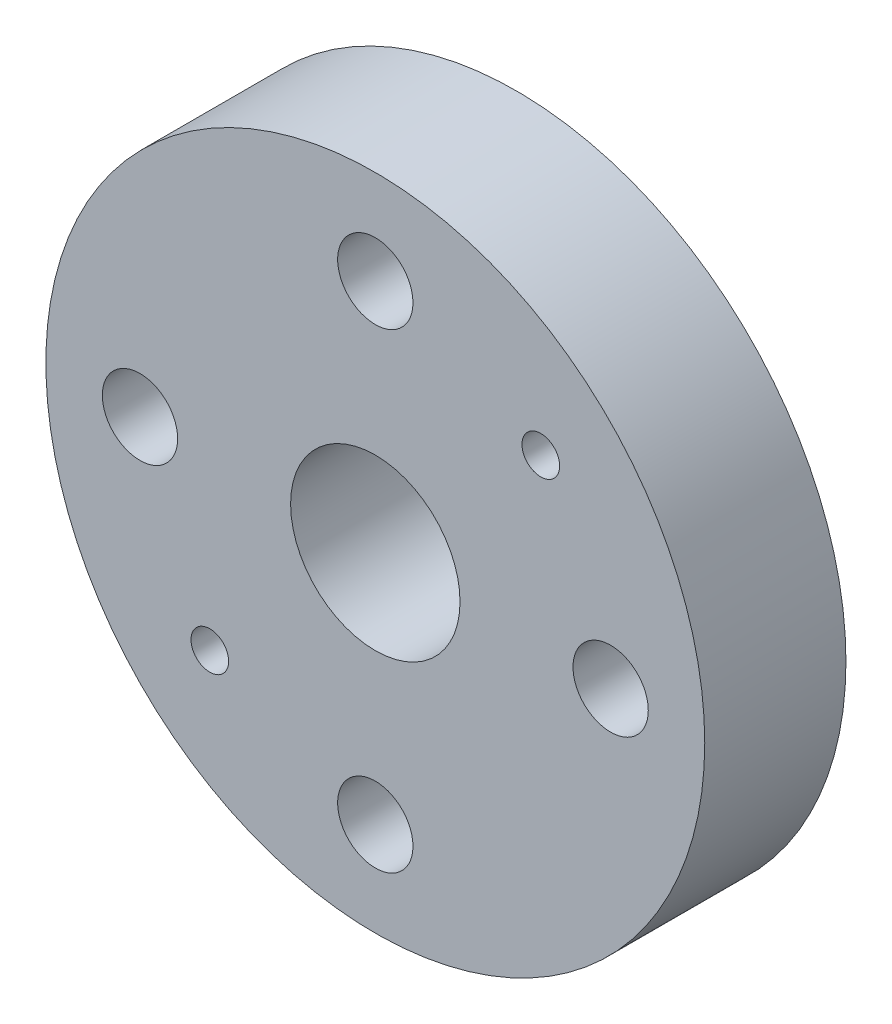
ISO-10303-21;
HEADER;
FILE_DESCRIPTION(('STEP AP214'),'2;1');
FILE_NAME('part.step','',(''),(''),'','','');
FILE_SCHEMA(('AUTOMOTIVE_DESIGN { 1 0 10303 214 1 1 1 1 }'));
ENDSEC;
DATA;
#1=APPLICATION_CONTEXT('core data for automotive mechanical design processes');
#2=APPLICATION_PROTOCOL_DEFINITION('international standard','automotive_design',2000,#1);
#3=PRODUCT_CONTEXT('',#1,'mechanical');
#4=PRODUCT('Part','Part','',(#3));
#5=PRODUCT_RELATED_PRODUCT_CATEGORY('part','',(#4));
#6=PRODUCT_DEFINITION_FORMATION('','',#4);
#7=PRODUCT_DEFINITION_CONTEXT('part definition',#1,'design');
#8=PRODUCT_DEFINITION('design','',#6,#7);
#9=PRODUCT_DEFINITION_SHAPE('','',#8);
#10=(LENGTH_UNIT() NAMED_UNIT(*) SI_UNIT(.MILLI.,.METRE.));
#11=(NAMED_UNIT(*) PLANE_ANGLE_UNIT() SI_UNIT($,.RADIAN.));
#12=(NAMED_UNIT(*) SI_UNIT($,.STERADIAN.) SOLID_ANGLE_UNIT());
#13=UNCERTAINTY_MEASURE_WITH_UNIT(LENGTH_MEASURE(1.E-05),#10,'distance_accuracy_value','');
#14=(GEOMETRIC_REPRESENTATION_CONTEXT(3) GLOBAL_UNCERTAINTY_ASSIGNED_CONTEXT((#13)) GLOBAL_UNIT_ASSIGNED_CONTEXT((#10,
#11,#12)) REPRESENTATION_CONTEXT('',''));
#15=CARTESIAN_POINT('',(0.,0.,0.));
#16=DIRECTION('',(0.,0.,1.));
#17=DIRECTION('',(1.,0.,0.));
#18=AXIS2_PLACEMENT_3D('',#15,#16,#17);
#19=CARTESIAN_POINT('',(-17.5810723961301,-17.773741682663,121.));
#20=DIRECTION('',(0.,0.,1.));
#21=DIRECTION('',(1.,0.,0.));
#22=AXIS2_PLACEMENT_3D('',#19,#20,#21);
#23=CYLINDRICAL_SURFACE('',#22,3.);
#24=CARTESIAN_POINT('',(-17.5810723961301,-17.773741682663,121.));
#25=DIRECTION('',(0.,0.,1.));
#26=DIRECTION('',(1.,0.,0.));
#27=AXIS2_PLACEMENT_3D('',#24,#25,#26);
#28=CIRCLE('',#27,3.);
#29=CARTESIAN_POINT('',(-14.5810723961301,-17.773741682663,121.));
#30=VERTEX_POINT('',#29);
#31=EDGE_CURVE('E83',#30,#30,#28,.T.);
#32=ORIENTED_EDGE('',*,*,#31,.F.);
#33=EDGE_LOOP('',(#32));
#34=FACE_BOUND('',#33,.T.);
#35=CARTESIAN_POINT('',(-17.5810723961301,-17.773741682663,129.5));
#36=DIRECTION('',(0.,0.,1.));
#37=DIRECTION('',(1.,0.,0.));
#38=AXIS2_PLACEMENT_3D('',#35,#36,#37);
#39=CIRCLE('',#38,3.);
#40=CARTESIAN_POINT('',(-14.5810723961301,-17.773741682663,129.5));
#41=VERTEX_POINT('',#40);
#42=EDGE_CURVE('E10',#41,#41,#39,.F.);
#43=ORIENTED_EDGE('',*,*,#42,.F.);
#44=EDGE_LOOP('',(#43));
#45=FACE_BOUND('',#44,.T.);
#46=ADVANCED_FACE('F45',(#34,#45),#23,.F.);
#47=CARTESIAN_POINT('',(17.5810723961301,17.773741682663,121.));
#48=DIRECTION('',(0.,0.,1.));
#49=DIRECTION('',(1.,0.,0.));
#50=AXIS2_PLACEMENT_3D('',#47,#48,#49);
#51=CYLINDRICAL_SURFACE('',#50,3.);
#52=CARTESIAN_POINT('',(17.5810723961301,17.773741682663,121.));
#53=DIRECTION('',(0.,0.,1.));
#54=DIRECTION('',(1.,0.,0.));
#55=AXIS2_PLACEMENT_3D('',#52,#53,#54);
#56=CIRCLE('',#55,3.);
#57=CARTESIAN_POINT('',(20.5810723961301,17.773741682663,121.));
#58=VERTEX_POINT('',#57);
#59=EDGE_CURVE('E110',#58,#58,#56,.T.);
#60=ORIENTED_EDGE('',*,*,#59,.F.);
#61=EDGE_LOOP('',(#60));
#62=FACE_BOUND('',#61,.T.);
#63=CARTESIAN_POINT('',(17.5810723961301,17.773741682663,129.5));
#64=DIRECTION('',(0.,0.,1.));
#65=DIRECTION('',(1.,0.,0.));
#66=AXIS2_PLACEMENT_3D('',#63,#64,#65);
#67=CIRCLE('',#66,3.);
#68=CARTESIAN_POINT('',(20.5810723961301,17.773741682663,129.5));
#69=VERTEX_POINT('',#68);
#70=EDGE_CURVE('E53',#69,#69,#67,.F.);
#71=ORIENTED_EDGE('',*,*,#70,.F.);
#72=EDGE_LOOP('',(#71));
#73=FACE_BOUND('',#72,.T.);
#74=ADVANCED_FACE('F147',(#62,#73),#51,.F.);
#75=CARTESIAN_POINT('',(0.,0.,136.));
#76=DIRECTION('',(0.,0.,-1.));
#77=DIRECTION('',(-1.,0.,0.));
#78=AXIS2_PLACEMENT_3D('',#75,#76,#77);
#79=CYLINDRICAL_SURFACE('',#78,35.);
#80=CARTESIAN_POINT('',(0.,0.,136.));
#81=DIRECTION('',(0.,0.,1.));
#82=DIRECTION('',(1.,0.,0.));
#83=AXIS2_PLACEMENT_3D('',#80,#81,#82);
#84=CIRCLE('',#83,35.);
#85=CARTESIAN_POINT('',(35.,0.,136.));
#86=VERTEX_POINT('',#85);
#87=EDGE_CURVE('E58',#86,#86,#84,.T.);
#88=ORIENTED_EDGE('',*,*,#87,.F.);
#89=EDGE_LOOP('',(#88));
#90=FACE_BOUND('',#89,.T.);
#91=CARTESIAN_POINT('',(0.,0.,121.));
#92=DIRECTION('',(0.,0.,1.));
#93=DIRECTION('',(1.,0.,0.));
#94=AXIS2_PLACEMENT_3D('',#91,#92,#93);
#95=CIRCLE('',#94,35.);
#96=CARTESIAN_POINT('',(35.,0.,121.));
#97=VERTEX_POINT('',#96);
#98=EDGE_CURVE('E63',#97,#97,#95,.T.);
#99=ORIENTED_EDGE('',*,*,#98,.T.);
#100=EDGE_LOOP('',(#99));
#101=FACE_BOUND('',#100,.T.);
#102=ADVANCED_FACE('F47',(#90,#101),#79,.T.);
#103=CARTESIAN_POINT('',(0.,0.,136.));
#104=DIRECTION('',(0.,0.,1.));
#105=DIRECTION('',(1.,0.,0.));
#106=AXIS2_PLACEMENT_3D('',#103,#104,#105);
#107=PLANE('',#106);
#108=CARTESIAN_POINT('',(-25.,0.,136.));
#109=DIRECTION('',(0.,0.,1.));
#110=DIRECTION('',(1.,0.,0.));
#111=AXIS2_PLACEMENT_3D('',#108,#109,#110);
#112=CIRCLE('',#111,4.);
#113=CARTESIAN_POINT('',(-21.,0.,136.));
#114=VERTEX_POINT('',#113);
#115=EDGE_CURVE('E103',#114,#114,#112,.T.);
#116=ORIENTED_EDGE('',*,*,#115,.F.);
#117=EDGE_LOOP('',(#116));
#118=FACE_BOUND('',#117,.T.);
#119=CARTESIAN_POINT('',(0.,25.,136.));
#120=DIRECTION('',(0.,0.,1.));
#121=DIRECTION('',(1.,0.,0.));
#122=AXIS2_PLACEMENT_3D('',#119,#120,#121);
#123=CIRCLE('',#122,4.);
#124=CARTESIAN_POINT('',(4.,25.,136.));
#125=VERTEX_POINT('',#124);
#126=EDGE_CURVE('E99',#125,#125,#123,.T.);
#127=ORIENTED_EDGE('',*,*,#126,.F.);
#128=EDGE_LOOP('',(#127));
#129=FACE_BOUND('',#128,.T.);
#130=CARTESIAN_POINT('',(25.,0.,136.));
#131=DIRECTION('',(0.,0.,1.));
#132=DIRECTION('',(1.,0.,0.));
#133=AXIS2_PLACEMENT_3D('',#130,#131,#132);
#134=CIRCLE('',#133,4.);
#135=CARTESIAN_POINT('',(29.,0.,136.));
#136=VERTEX_POINT('',#135);
#137=EDGE_CURVE('E91',#136,#136,#134,.T.);
#138=ORIENTED_EDGE('',*,*,#137,.F.);
#139=EDGE_LOOP('',(#138));
#140=FACE_BOUND('',#139,.T.);
#141=CARTESIAN_POINT('',(0.,-25.,136.));
#142=DIRECTION('',(0.,0.,1.));
#143=DIRECTION('',(1.,0.,0.));
#144=AXIS2_PLACEMENT_3D('',#141,#142,#143);
#145=CIRCLE('',#144,4.);
#146=CARTESIAN_POINT('',(4.,-25.,136.));
#147=VERTEX_POINT('',#146);
#148=EDGE_CURVE('E82',#147,#147,#145,.T.);
#149=ORIENTED_EDGE('',*,*,#148,.F.);
#150=EDGE_LOOP('',(#149));
#151=FACE_BOUND('',#150,.T.);
#152=CARTESIAN_POINT('',(0.,0.,136.));
#153=DIRECTION('',(0.,0.,1.));
#154=DIRECTION('',(1.,0.,0.));
#155=AXIS2_PLACEMENT_3D('',#152,#153,#154);
#156=CIRCLE('',#155,9.);
#157=CARTESIAN_POINT('',(9.,0.,136.));
#158=VERTEX_POINT('',#157);
#159=EDGE_CURVE('E68',#158,#158,#156,.T.);
#160=ORIENTED_EDGE('',*,*,#159,.F.);
#161=EDGE_LOOP('',(#160));
#162=FACE_BOUND('',#161,.T.);
#163=ORIENTED_EDGE('',*,*,#87,.T.);
#164=EDGE_LOOP('',(#163));
#165=FACE_BOUND('',#164,.T.);
#166=CARTESIAN_POINT('',(17.5810723961301,17.773741682663,136.));
#167=DIRECTION('',(0.,0.,1.));
#168=DIRECTION('',(1.,0.,0.));
#169=AXIS2_PLACEMENT_3D('',#166,#167,#168);
#170=CIRCLE('',#169,2.);
#171=CARTESIAN_POINT('',(19.5810723961301,17.773741682663,136.));
#172=VERTEX_POINT('',#171);
#173=EDGE_CURVE('E118',#172,#172,#170,.T.);
#174=ORIENTED_EDGE('',*,*,#173,.F.);
#175=EDGE_LOOP('',(#174));
#176=FACE_BOUND('',#175,.T.);
#177=CARTESIAN_POINT('',(-17.5810723961301,-17.773741682663,136.));
#178=DIRECTION('',(0.,0.,1.));
#179=DIRECTION('',(1.,0.,0.));
#180=AXIS2_PLACEMENT_3D('',#177,#178,#179);
#181=CIRCLE('',#180,2.);
#182=CARTESIAN_POINT('',(-15.5810723961301,-17.773741682663,136.));
#183=VERTEX_POINT('',#182);
#184=EDGE_CURVE('E122',#183,#183,#181,.T.);
#185=ORIENTED_EDGE('',*,*,#184,.F.);
#186=EDGE_LOOP('',(#185));
#187=FACE_BOUND('',#186,.T.);
#188=ADVANCED_FACE('F136',(#118,#129,#140,#151,#162,#165,#176,#187),#107,.T.);
#189=CARTESIAN_POINT('',(0.,0.,121.));
#190=DIRECTION('',(0.,0.,1.));
#191=DIRECTION('',(1.,0.,0.));
#192=AXIS2_PLACEMENT_3D('',#189,#190,#191);
#193=PLANE('',#192);
#194=ORIENTED_EDGE('',*,*,#31,.T.);
#195=EDGE_LOOP('',(#194));
#196=FACE_BOUND('',#195,.T.);
#197=ORIENTED_EDGE('',*,*,#59,.T.);
#198=EDGE_LOOP('',(#197));
#199=FACE_BOUND('',#198,.T.);
#200=CARTESIAN_POINT('',(0.,0.,121.));
#201=DIRECTION('',(0.,0.,-1.));
#202=DIRECTION('',(-1.,0.,0.));
#203=AXIS2_PLACEMENT_3D('',#200,#201,#202);
#204=CIRCLE('',#203,9.);
#205=CARTESIAN_POINT('',(-9.,0.,121.));
#206=VERTEX_POINT('',#205);
#207=EDGE_CURVE('E73',#206,#206,#204,.T.);
#208=ORIENTED_EDGE('',*,*,#207,.F.);
#209=EDGE_LOOP('',(#208));
#210=FACE_BOUND('',#209,.T.);
#211=ORIENTED_EDGE('',*,*,#98,.F.);
#212=EDGE_LOOP('',(#211));
#213=FACE_BOUND('',#212,.T.);
#214=ADVANCED_FACE('F138',(#196,#199,#210,#213),#193,.F.);
#215=CARTESIAN_POINT('',(0.,0.,167.));
#216=DIRECTION('',(0.,0.,-1.));
#217=DIRECTION('',(-1.,0.,0.));
#218=AXIS2_PLACEMENT_3D('',#215,#216,#217);
#219=CYLINDRICAL_SURFACE('',#218,9.);
#220=ORIENTED_EDGE('',*,*,#159,.T.);
#221=EDGE_LOOP('',(#220));
#222=FACE_BOUND('',#221,.T.);
#223=ORIENTED_EDGE('',*,*,#207,.T.);
#224=EDGE_LOOP('',(#223));
#225=FACE_BOUND('',#224,.T.);
#226=ADVANCED_FACE('F145',(#222,#225),#219,.F.);
#227=CARTESIAN_POINT('',(0.,-25.,129.5));
#228=DIRECTION('',(0.,0.,1.));
#229=DIRECTION('',(1.,0.,0.));
#230=AXIS2_PLACEMENT_3D('',#227,#228,#229);
#231=CYLINDRICAL_SURFACE('',#230,4.);
#232=CARTESIAN_POINT('',(0.,-25.,129.5));
#233=DIRECTION('',(0.,0.,1.));
#234=DIRECTION('',(1.,0.,0.));
#235=AXIS2_PLACEMENT_3D('',#232,#233,#234);
#236=CIRCLE('',#235,4.);
#237=CARTESIAN_POINT('',(4.,-25.,129.5));
#238=VERTEX_POINT('',#237);
#239=EDGE_CURVE('E78',#238,#238,#236,.T.);
#240=CARTESIAN_POINT('',(4.,-25.,129.5));
#241=CARTESIAN_POINT('',(4.,-25.,129.567708333333));
#242=CARTESIAN_POINT('',(4.,-25.,129.635416666667));
#243=CARTESIAN_POINT('',(4.,-25.,129.770833333333));
#244=CARTESIAN_POINT('',(4.,-25.,129.838541666667));
#245=CARTESIAN_POINT('',(4.,-25.,129.973958333333));
#246=CARTESIAN_POINT('',(4.,-25.,130.041666666667));
#247=CARTESIAN_POINT('',(4.,-25.,130.177083333333));
#248=CARTESIAN_POINT('',(4.,-25.,130.244791666667));
#249=CARTESIAN_POINT('',(4.,-25.,130.380208333333));
#250=CARTESIAN_POINT('',(4.,-25.,130.447916666667));
#251=CARTESIAN_POINT('',(4.,-25.,130.583333333333));
#252=CARTESIAN_POINT('',(4.,-25.,130.651041666667));
#253=CARTESIAN_POINT('',(4.,-25.,130.786458333333));
#254=CARTESIAN_POINT('',(4.,-25.,130.854166666667));
#255=CARTESIAN_POINT('',(4.,-25.,130.989583333333));
#256=CARTESIAN_POINT('',(4.,-25.,131.057291666667));
#257=CARTESIAN_POINT('',(4.,-25.,131.192708333333));
#258=CARTESIAN_POINT('',(4.,-25.,131.260416666667));
#259=CARTESIAN_POINT('',(4.,-25.,131.395833333333));
#260=CARTESIAN_POINT('',(4.,-25.,131.463541666667));
#261=CARTESIAN_POINT('',(4.,-25.,131.598958333333));
#262=CARTESIAN_POINT('',(4.,-25.,131.666666666667));
#263=CARTESIAN_POINT('',(4.,-25.,131.802083333333));
#264=CARTESIAN_POINT('',(4.,-25.,131.869791666667));
#265=CARTESIAN_POINT('',(4.,-25.,132.005208333333));
#266=CARTESIAN_POINT('',(4.,-25.,132.072916666667));
#267=CARTESIAN_POINT('',(4.,-25.,132.208333333333));
#268=CARTESIAN_POINT('',(4.,-25.,132.276041666667));
#269=CARTESIAN_POINT('',(4.,-25.,132.411458333333));
#270=CARTESIAN_POINT('',(4.,-25.,132.479166666667));
#271=CARTESIAN_POINT('',(4.,-25.,132.614583333333));
#272=CARTESIAN_POINT('',(4.,-25.,132.682291666667));
#273=CARTESIAN_POINT('',(4.,-25.,132.817708333333));
#274=CARTESIAN_POINT('',(4.,-25.,132.885416666667));
#275=CARTESIAN_POINT('',(4.,-25.,133.020833333333));
#276=CARTESIAN_POINT('',(4.,-25.,133.088541666667));
#277=CARTESIAN_POINT('',(4.,-25.,133.223958333333));
#278=CARTESIAN_POINT('',(4.,-25.,133.291666666667));
#279=CARTESIAN_POINT('',(4.,-25.,133.427083333333));
#280=CARTESIAN_POINT('',(4.,-25.,133.494791666667));
#281=CARTESIAN_POINT('',(4.,-25.,133.630208333333));
#282=CARTESIAN_POINT('',(4.,-25.,133.697916666667));
#283=CARTESIAN_POINT('',(4.,-25.,133.833333333333));
#284=CARTESIAN_POINT('',(4.,-25.,133.901041666667));
#285=CARTESIAN_POINT('',(4.,-25.,134.036458333333));
#286=CARTESIAN_POINT('',(4.,-25.,134.104166666667));
#287=CARTESIAN_POINT('',(4.,-25.,134.239583333333));
#288=CARTESIAN_POINT('',(4.,-25.,134.307291666667));
#289=CARTESIAN_POINT('',(4.,-25.,134.442708333333));
#290=CARTESIAN_POINT('',(4.,-25.,134.510416666667));
#291=CARTESIAN_POINT('',(4.,-25.,134.645833333333));
#292=CARTESIAN_POINT('',(4.,-25.,134.713541666667));
#293=CARTESIAN_POINT('',(4.,-25.,134.848958333333));
#294=CARTESIAN_POINT('',(4.,-25.,134.916666666667));
#295=CARTESIAN_POINT('',(4.,-25.,135.052083333333));
#296=CARTESIAN_POINT('',(4.,-25.,135.119791666667));
#297=CARTESIAN_POINT('',(4.,-25.,135.255208333333));
#298=CARTESIAN_POINT('',(4.,-25.,135.322916666667));
#299=CARTESIAN_POINT('',(4.,-25.,135.458333333333));
#300=CARTESIAN_POINT('',(4.,-25.,135.526041666667));
#301=CARTESIAN_POINT('',(4.,-25.,135.661458333333));
#302=CARTESIAN_POINT('',(4.,-25.,135.729166666667));
#303=CARTESIAN_POINT('',(4.,-25.,135.864583333333));
#304=CARTESIAN_POINT('',(4.,-25.,135.932291666667));
#305=CARTESIAN_POINT('',(4.,-25.,136.));
#306=B_SPLINE_CURVE_WITH_KNOTS('',3,(#240,#241,#242,#243,#244,#245,#246,#247,#248,#249,#250,
#251,#252,#253,#254,#255,#256,#257,#258,#259,#260,#261,#262,#263,#264,#265,#266,#267,#268,#269,
#270,#271,#272,#273,#274,#275,#276,#277,#278,#279,#280,#281,#282,#283,#284,#285,#286,#287,#288,
#289,#290,#291,#292,#293,#294,#295,#296,#297,#298,#299,#300,#301,#302,#303,#304,#305),
.UNSPECIFIED.,.F.,.F.,(4,2,2,2,2,2,2,2,2,2,2,2,2,2,2,2,2,2,2,2,2,2,2,2,2,2,2,2,2,2,2,2,4),(0.,
0.203125000000026,0.406250000000025,0.609375000000023,0.812500000000022,1.01562500000002,
1.21875000000002,1.42187500000002,1.62500000000002,1.82812500000001,2.03125000000001,
2.23437500000001,2.43750000000001,2.64062500000001,2.84375000000001,3.046875,3.25000000000003,
3.45312500000003,3.65625000000003,3.85937500000003,4.06250000000002,4.26562500000002,
4.46875000000002,4.67187500000002,4.87500000000002,5.07812500000002,5.28125000000002,
5.48437500000001,5.68750000000001,5.89062500000001,6.09375000000001,6.29687500000001,
6.50000000000003),.UNSPECIFIED.);
#307=EDGE_CURVE('BSEAM191',#238,#147,#306,.T.);
#308=ORIENTED_EDGE('',*,*,#239,.F.);
#309=ORIENTED_EDGE('',*,*,#148,.T.);
#310=ORIENTED_EDGE('',*,*,#307,.T.);
#311=ORIENTED_EDGE('',*,*,#307,.F.);
#312=EDGE_LOOP('',(#308,#310,#309,#311));
#313=FACE_BOUND('',#312,.T.);
#314=ADVANCED_FACE('F191',(#313),#231,.F.);
#315=CARTESIAN_POINT('',(0.,-25.,129.5));
#316=DIRECTION('',(0.,0.,1.));
#317=DIRECTION('',(1.,0.,0.));
#318=AXIS2_PLACEMENT_3D('',#315,#316,#317);
#319=PLANE('',#318);
#320=ORIENTED_EDGE('',*,*,#239,.T.);
#321=EDGE_LOOP('',(#320));
#322=FACE_BOUND('',#321,.T.);
#323=ADVANCED_FACE('F186',(#322),#319,.T.);
#324=CARTESIAN_POINT('',(25.,0.,129.5));
#325=DIRECTION('',(0.,0.,1.));
#326=DIRECTION('',(1.,0.,0.));
#327=AXIS2_PLACEMENT_3D('',#324,#325,#326);
#328=CYLINDRICAL_SURFACE('',#327,4.);
#329=CARTESIAN_POINT('',(25.,0.,129.5));
#330=DIRECTION('',(0.,0.,1.));
#331=DIRECTION('',(1.,0.,0.));
#332=AXIS2_PLACEMENT_3D('',#329,#330,#331);
#333=CIRCLE('',#332,4.);
#334=CARTESIAN_POINT('',(29.,0.,129.5));
#335=VERTEX_POINT('',#334);
#336=EDGE_CURVE('E87',#335,#335,#333,.T.);
#337=CARTESIAN_POINT('',(29.,0.,129.5));
#338=CARTESIAN_POINT('',(29.,0.,129.567708333333));
#339=CARTESIAN_POINT('',(29.,0.,129.635416666667));
#340=CARTESIAN_POINT('',(29.,0.,129.770833333333));
#341=CARTESIAN_POINT('',(29.,0.,129.838541666667));
#342=CARTESIAN_POINT('',(29.,0.,129.973958333333));
#343=CARTESIAN_POINT('',(29.,0.,130.041666666667));
#344=CARTESIAN_POINT('',(29.,0.,130.177083333333));
#345=CARTESIAN_POINT('',(29.,0.,130.244791666667));
#346=CARTESIAN_POINT('',(29.,0.,130.380208333333));
#347=CARTESIAN_POINT('',(29.,0.,130.447916666667));
#348=CARTESIAN_POINT('',(29.,0.,130.583333333333));
#349=CARTESIAN_POINT('',(29.,0.,130.651041666667));
#350=CARTESIAN_POINT('',(29.,0.,130.786458333333));
#351=CARTESIAN_POINT('',(29.,0.,130.854166666667));
#352=CARTESIAN_POINT('',(29.,0.,130.989583333333));
#353=CARTESIAN_POINT('',(29.,0.,131.057291666667));
#354=CARTESIAN_POINT('',(29.,0.,131.192708333333));
#355=CARTESIAN_POINT('',(29.,0.,131.260416666667));
#356=CARTESIAN_POINT('',(29.,0.,131.395833333333));
#357=CARTESIAN_POINT('',(29.,0.,131.463541666667));
#358=CARTESIAN_POINT('',(29.,0.,131.598958333333));
#359=CARTESIAN_POINT('',(29.,0.,131.666666666667));
#360=CARTESIAN_POINT('',(29.,0.,131.802083333333));
#361=CARTESIAN_POINT('',(29.,0.,131.869791666667));
#362=CARTESIAN_POINT('',(29.,0.,132.005208333333));
#363=CARTESIAN_POINT('',(29.,0.,132.072916666667));
#364=CARTESIAN_POINT('',(29.,0.,132.208333333333));
#365=CARTESIAN_POINT('',(29.,0.,132.276041666667));
#366=CARTESIAN_POINT('',(29.,0.,132.411458333333));
#367=CARTESIAN_POINT('',(29.,0.,132.479166666667));
#368=CARTESIAN_POINT('',(29.,0.,132.614583333333));
#369=CARTESIAN_POINT('',(29.,0.,132.682291666667));
#370=CARTESIAN_POINT('',(29.,0.,132.817708333333));
#371=CARTESIAN_POINT('',(29.,0.,132.885416666667));
#372=CARTESIAN_POINT('',(29.,0.,133.020833333333));
#373=CARTESIAN_POINT('',(29.,0.,133.088541666667));
#374=CARTESIAN_POINT('',(29.,0.,133.223958333333));
#375=CARTESIAN_POINT('',(29.,0.,133.291666666667));
#376=CARTESIAN_POINT('',(29.,0.,133.427083333333));
#377=CARTESIAN_POINT('',(29.,0.,133.494791666667));
#378=CARTESIAN_POINT('',(29.,0.,133.630208333333));
#379=CARTESIAN_POINT('',(29.,0.,133.697916666667));
#380=CARTESIAN_POINT('',(29.,0.,133.833333333333));
#381=CARTESIAN_POINT('',(29.,0.,133.901041666667));
#382=CARTESIAN_POINT('',(29.,0.,134.036458333333));
#383=CARTESIAN_POINT('',(29.,0.,134.104166666667));
#384=CARTESIAN_POINT('',(29.,0.,134.239583333333));
#385=CARTESIAN_POINT('',(29.,0.,134.307291666667));
#386=CARTESIAN_POINT('',(29.,0.,134.442708333333));
#387=CARTESIAN_POINT('',(29.,0.,134.510416666667));
#388=CARTESIAN_POINT('',(29.,0.,134.645833333333));
#389=CARTESIAN_POINT('',(29.,0.,134.713541666667));
#390=CARTESIAN_POINT('',(29.,0.,134.848958333333));
#391=CARTESIAN_POINT('',(29.,0.,134.916666666667));
#392=CARTESIAN_POINT('',(29.,0.,135.052083333333));
#393=CARTESIAN_POINT('',(29.,0.,135.119791666667));
#394=CARTESIAN_POINT('',(29.,0.,135.255208333333));
#395=CARTESIAN_POINT('',(29.,0.,135.322916666667));
#396=CARTESIAN_POINT('',(29.,0.,135.458333333333));
#397=CARTESIAN_POINT('',(29.,0.,135.526041666667));
#398=CARTESIAN_POINT('',(29.,0.,135.661458333333));
#399=CARTESIAN_POINT('',(29.,0.,135.729166666667));
#400=CARTESIAN_POINT('',(29.,0.,135.864583333333));
#401=CARTESIAN_POINT('',(29.,0.,135.932291666667));
#402=CARTESIAN_POINT('',(29.,0.,136.));
#403=B_SPLINE_CURVE_WITH_KNOTS('',3,(#337,#338,#339,#340,#341,#342,#343,#344,#345,#346,#347,
#348,#349,#350,#351,#352,#353,#354,#355,#356,#357,#358,#359,#360,#361,#362,#363,#364,#365,#366,
#367,#368,#369,#370,#371,#372,#373,#374,#375,#376,#377,#378,#379,#380,#381,#382,#383,#384,#385,
#386,#387,#388,#389,#390,#391,#392,#393,#394,#395,#396,#397,#398,#399,#400,#401,#402),
.UNSPECIFIED.,.F.,.F.,(4,2,2,2,2,2,2,2,2,2,2,2,2,2,2,2,2,2,2,2,2,2,2,2,2,2,2,2,2,2,2,2,4),(0.,
0.203125000000026,0.406250000000025,0.609375000000023,0.812500000000022,1.01562500000002,
1.21875000000002,1.42187500000002,1.62500000000002,1.82812500000001,2.03125000000001,
2.23437500000001,2.43750000000001,2.64062500000001,2.84375000000001,3.046875,3.25000000000003,
3.45312500000003,3.65625000000003,3.85937500000003,4.06250000000002,4.26562500000002,
4.46875000000002,4.67187500000002,4.87500000000002,5.07812500000002,5.28125000000002,
5.48437500000001,5.68750000000001,5.89062500000001,6.09375000000001,6.29687500000001,
6.50000000000003),.UNSPECIFIED.);
#404=EDGE_CURVE('BSEAM183',#335,#136,#403,.T.);
#405=ORIENTED_EDGE('',*,*,#336,.F.);
#406=ORIENTED_EDGE('',*,*,#137,.T.);
#407=ORIENTED_EDGE('',*,*,#404,.T.);
#408=ORIENTED_EDGE('',*,*,#404,.F.);
#409=EDGE_LOOP('',(#405,#407,#406,#408));
#410=FACE_BOUND('',#409,.T.);
#411=ADVANCED_FACE('F183',(#410),#328,.F.);
#412=CARTESIAN_POINT('',(25.,0.,129.5));
#413=DIRECTION('',(0.,0.,1.));
#414=DIRECTION('',(1.,0.,0.));
#415=AXIS2_PLACEMENT_3D('',#412,#413,#414);
#416=PLANE('',#415);
#417=ORIENTED_EDGE('',*,*,#336,.T.);
#418=EDGE_LOOP('',(#417));
#419=FACE_BOUND('',#418,.T.);
#420=ADVANCED_FACE('F178',(#419),#416,.T.);
#421=CARTESIAN_POINT('',(0.,25.,129.5));
#422=DIRECTION('',(0.,0.,1.));
#423=DIRECTION('',(1.,0.,0.));
#424=AXIS2_PLACEMENT_3D('',#421,#422,#423);
#425=CYLINDRICAL_SURFACE('',#424,4.);
#426=CARTESIAN_POINT('',(0.,25.,129.5));
#427=DIRECTION('',(0.,0.,1.));
#428=DIRECTION('',(1.,0.,0.));
#429=AXIS2_PLACEMENT_3D('',#426,#427,#428);
#430=CIRCLE('',#429,4.);
#431=CARTESIAN_POINT('',(4.,25.,129.5));
#432=VERTEX_POINT('',#431);
#433=EDGE_CURVE('E95',#432,#432,#430,.T.);
#434=CARTESIAN_POINT('',(4.,25.,129.5));
#435=CARTESIAN_POINT('',(4.,25.,129.567708333333));
#436=CARTESIAN_POINT('',(4.,25.,129.635416666667));
#437=CARTESIAN_POINT('',(4.,25.,129.770833333333));
#438=CARTESIAN_POINT('',(4.,25.,129.838541666667));
#439=CARTESIAN_POINT('',(4.,25.,129.973958333333));
#440=CARTESIAN_POINT('',(4.,25.,130.041666666667));
#441=CARTESIAN_POINT('',(4.,25.,130.177083333333));
#442=CARTESIAN_POINT('',(4.,25.,130.244791666667));
#443=CARTESIAN_POINT('',(4.,25.,130.380208333333));
#444=CARTESIAN_POINT('',(4.,25.,130.447916666667));
#445=CARTESIAN_POINT('',(4.,25.,130.583333333333));
#446=CARTESIAN_POINT('',(4.,25.,130.651041666667));
#447=CARTESIAN_POINT('',(4.,25.,130.786458333333));
#448=CARTESIAN_POINT('',(4.,25.,130.854166666667));
#449=CARTESIAN_POINT('',(4.,25.,130.989583333333));
#450=CARTESIAN_POINT('',(4.,25.,131.057291666667));
#451=CARTESIAN_POINT('',(4.,25.,131.192708333333));
#452=CARTESIAN_POINT('',(4.,25.,131.260416666667));
#453=CARTESIAN_POINT('',(4.,25.,131.395833333333));
#454=CARTESIAN_POINT('',(4.,25.,131.463541666667));
#455=CARTESIAN_POINT('',(4.,25.,131.598958333333));
#456=CARTESIAN_POINT('',(4.,25.,131.666666666667));
#457=CARTESIAN_POINT('',(4.,25.,131.802083333333));
#458=CARTESIAN_POINT('',(4.,25.,131.869791666667));
#459=CARTESIAN_POINT('',(4.,25.,132.005208333333));
#460=CARTESIAN_POINT('',(4.,25.,132.072916666667));
#461=CARTESIAN_POINT('',(4.,25.,132.208333333333));
#462=CARTESIAN_POINT('',(4.,25.,132.276041666667));
#463=CARTESIAN_POINT('',(4.,25.,132.411458333333));
#464=CARTESIAN_POINT('',(4.,25.,132.479166666667));
#465=CARTESIAN_POINT('',(4.,25.,132.614583333333));
#466=CARTESIAN_POINT('',(4.,25.,132.682291666667));
#467=CARTESIAN_POINT('',(4.,25.,132.817708333333));
#468=CARTESIAN_POINT('',(4.,25.,132.885416666667));
#469=CARTESIAN_POINT('',(4.,25.,133.020833333333));
#470=CARTESIAN_POINT('',(4.,25.,133.088541666667));
#471=CARTESIAN_POINT('',(4.,25.,133.223958333333));
#472=CARTESIAN_POINT('',(4.,25.,133.291666666667));
#473=CARTESIAN_POINT('',(4.,25.,133.427083333333));
#474=CARTESIAN_POINT('',(4.,25.,133.494791666667));
#475=CARTESIAN_POINT('',(4.,25.,133.630208333333));
#476=CARTESIAN_POINT('',(4.,25.,133.697916666667));
#477=CARTESIAN_POINT('',(4.,25.,133.833333333333));
#478=CARTESIAN_POINT('',(4.,25.,133.901041666667));
#479=CARTESIAN_POINT('',(4.,25.,134.036458333333));
#480=CARTESIAN_POINT('',(4.,25.,134.104166666667));
#481=CARTESIAN_POINT('',(4.,25.,134.239583333333));
#482=CARTESIAN_POINT('',(4.,25.,134.307291666667));
#483=CARTESIAN_POINT('',(4.,25.,134.442708333333));
#484=CARTESIAN_POINT('',(4.,25.,134.510416666667));
#485=CARTESIAN_POINT('',(4.,25.,134.645833333333));
#486=CARTESIAN_POINT('',(4.,25.,134.713541666667));
#487=CARTESIAN_POINT('',(4.,25.,134.848958333333));
#488=CARTESIAN_POINT('',(4.,25.,134.916666666667));
#489=CARTESIAN_POINT('',(4.,25.,135.052083333333));
#490=CARTESIAN_POINT('',(4.,25.,135.119791666667));
#491=CARTESIAN_POINT('',(4.,25.,135.255208333333));
#492=CARTESIAN_POINT('',(4.,25.,135.322916666667));
#493=CARTESIAN_POINT('',(4.,25.,135.458333333333));
#494=CARTESIAN_POINT('',(4.,25.,135.526041666667));
#495=CARTESIAN_POINT('',(4.,25.,135.661458333333));
#496=CARTESIAN_POINT('',(4.,25.,135.729166666667));
#497=CARTESIAN_POINT('',(4.,25.,135.864583333333));
#498=CARTESIAN_POINT('',(4.,25.,135.932291666667));
#499=CARTESIAN_POINT('',(4.,25.,136.));
#500=B_SPLINE_CURVE_WITH_KNOTS('',3,(#434,#435,#436,#437,#438,#439,#440,#441,#442,#443,#444,
#445,#446,#447,#448,#449,#450,#451,#452,#453,#454,#455,#456,#457,#458,#459,#460,#461,#462,#463,
#464,#465,#466,#467,#468,#469,#470,#471,#472,#473,#474,#475,#476,#477,#478,#479,#480,#481,#482,
#483,#484,#485,#486,#487,#488,#489,#490,#491,#492,#493,#494,#495,#496,#497,#498,#499),
.UNSPECIFIED.,.F.,.F.,(4,2,2,2,2,2,2,2,2,2,2,2,2,2,2,2,2,2,2,2,2,2,2,2,2,2,2,2,2,2,2,2,4),(0.,
0.203125000000026,0.406250000000025,0.609375000000023,0.812500000000022,1.01562500000002,
1.21875000000002,1.42187500000002,1.62500000000002,1.82812500000001,2.03125000000001,
2.23437500000001,2.43750000000001,2.64062500000001,2.84375000000001,3.046875,3.25000000000003,
3.45312500000003,3.65625000000003,3.85937500000003,4.06250000000002,4.26562500000002,
4.46875000000002,4.67187500000002,4.87500000000002,5.07812500000002,5.28125000000002,
5.48437500000001,5.68750000000001,5.89062500000001,6.09375000000001,6.29687500000001,
6.50000000000003),.UNSPECIFIED.);
#501=EDGE_CURVE('BSEAM175',#432,#125,#500,.T.);
#502=ORIENTED_EDGE('',*,*,#433,.F.);
#503=ORIENTED_EDGE('',*,*,#126,.T.);
#504=ORIENTED_EDGE('',*,*,#501,.T.);
#505=ORIENTED_EDGE('',*,*,#501,.F.);
#506=EDGE_LOOP('',(#502,#504,#503,#505));
#507=FACE_BOUND('',#506,.T.);
#508=ADVANCED_FACE('F175',(#507),#425,.F.);
#509=CARTESIAN_POINT('',(0.,25.,129.5));
#510=DIRECTION('',(0.,0.,1.));
#511=DIRECTION('',(1.,0.,0.));
#512=AXIS2_PLACEMENT_3D('',#509,#510,#511);
#513=PLANE('',#512);
#514=ORIENTED_EDGE('',*,*,#433,.T.);
#515=EDGE_LOOP('',(#514));
#516=FACE_BOUND('',#515,.T.);
#517=ADVANCED_FACE('F173',(#516),#513,.T.);
#518=CARTESIAN_POINT('',(-25.,0.,129.5));
#519=DIRECTION('',(0.,0.,1.));
#520=DIRECTION('',(1.,0.,0.));
#521=AXIS2_PLACEMENT_3D('',#518,#519,#520);
#522=CYLINDRICAL_SURFACE('',#521,4.);
#523=CARTESIAN_POINT('',(-25.,0.,129.5));
#524=DIRECTION('',(0.,0.,1.));
#525=DIRECTION('',(1.,0.,0.));
#526=AXIS2_PLACEMENT_3D('',#523,#524,#525);
#527=CIRCLE('',#526,4.);
#528=CARTESIAN_POINT('',(-21.,0.,129.5));
#529=VERTEX_POINT('',#528);
#530=EDGE_CURVE('E77',#529,#529,#527,.T.);
#531=CARTESIAN_POINT('',(-21.,0.,129.5));
#532=CARTESIAN_POINT('',(-21.,0.,129.567708333333));
#533=CARTESIAN_POINT('',(-21.,0.,129.635416666667));
#534=CARTESIAN_POINT('',(-21.,0.,129.770833333333));
#535=CARTESIAN_POINT('',(-21.,0.,129.838541666667));
#536=CARTESIAN_POINT('',(-21.,0.,129.973958333333));
#537=CARTESIAN_POINT('',(-21.,0.,130.041666666667));
#538=CARTESIAN_POINT('',(-21.,0.,130.177083333333));
#539=CARTESIAN_POINT('',(-21.,0.,130.244791666667));
#540=CARTESIAN_POINT('',(-21.,0.,130.380208333333));
#541=CARTESIAN_POINT('',(-21.,0.,130.447916666667));
#542=CARTESIAN_POINT('',(-21.,0.,130.583333333333));
#543=CARTESIAN_POINT('',(-21.,0.,130.651041666667));
#544=CARTESIAN_POINT('',(-21.,0.,130.786458333333));
#545=CARTESIAN_POINT('',(-21.,0.,130.854166666667));
#546=CARTESIAN_POINT('',(-21.,0.,130.989583333333));
#547=CARTESIAN_POINT('',(-21.,0.,131.057291666667));
#548=CARTESIAN_POINT('',(-21.,0.,131.192708333333));
#549=CARTESIAN_POINT('',(-21.,0.,131.260416666667));
#550=CARTESIAN_POINT('',(-21.,0.,131.395833333333));
#551=CARTESIAN_POINT('',(-21.,0.,131.463541666667));
#552=CARTESIAN_POINT('',(-21.,0.,131.598958333333));
#553=CARTESIAN_POINT('',(-21.,0.,131.666666666667));
#554=CARTESIAN_POINT('',(-21.,0.,131.802083333333));
#555=CARTESIAN_POINT('',(-21.,0.,131.869791666667));
#556=CARTESIAN_POINT('',(-21.,0.,132.005208333333));
#557=CARTESIAN_POINT('',(-21.,0.,132.072916666667));
#558=CARTESIAN_POINT('',(-21.,0.,132.208333333333));
#559=CARTESIAN_POINT('',(-21.,0.,132.276041666667));
#560=CARTESIAN_POINT('',(-21.,0.,132.411458333333));
#561=CARTESIAN_POINT('',(-21.,0.,132.479166666667));
#562=CARTESIAN_POINT('',(-21.,0.,132.614583333333));
#563=CARTESIAN_POINT('',(-21.,0.,132.682291666667));
#564=CARTESIAN_POINT('',(-21.,0.,132.817708333333));
#565=CARTESIAN_POINT('',(-21.,0.,132.885416666667));
#566=CARTESIAN_POINT('',(-21.,0.,133.020833333333));
#567=CARTESIAN_POINT('',(-21.,0.,133.088541666667));
#568=CARTESIAN_POINT('',(-21.,0.,133.223958333333));
#569=CARTESIAN_POINT('',(-21.,0.,133.291666666667));
#570=CARTESIAN_POINT('',(-21.,0.,133.427083333333));
#571=CARTESIAN_POINT('',(-21.,0.,133.494791666667));
#572=CARTESIAN_POINT('',(-21.,0.,133.630208333333));
#573=CARTESIAN_POINT('',(-21.,0.,133.697916666667));
#574=CARTESIAN_POINT('',(-21.,0.,133.833333333333));
#575=CARTESIAN_POINT('',(-21.,0.,133.901041666667));
#576=CARTESIAN_POINT('',(-21.,0.,134.036458333333));
#577=CARTESIAN_POINT('',(-21.,0.,134.104166666667));
#578=CARTESIAN_POINT('',(-21.,0.,134.239583333333));
#579=CARTESIAN_POINT('',(-21.,0.,134.307291666667));
#580=CARTESIAN_POINT('',(-21.,0.,134.442708333333));
#581=CARTESIAN_POINT('',(-21.,0.,134.510416666667));
#582=CARTESIAN_POINT('',(-21.,0.,134.645833333333));
#583=CARTESIAN_POINT('',(-21.,0.,134.713541666667));
#584=CARTESIAN_POINT('',(-21.,0.,134.848958333333));
#585=CARTESIAN_POINT('',(-21.,0.,134.916666666667));
#586=CARTESIAN_POINT('',(-21.,0.,135.052083333333));
#587=CARTESIAN_POINT('',(-21.,0.,135.119791666667));
#588=CARTESIAN_POINT('',(-21.,0.,135.255208333333));
#589=CARTESIAN_POINT('',(-21.,0.,135.322916666667));
#590=CARTESIAN_POINT('',(-21.,0.,135.458333333333));
#591=CARTESIAN_POINT('',(-21.,0.,135.526041666667));
#592=CARTESIAN_POINT('',(-21.,0.,135.661458333333));
#593=CARTESIAN_POINT('',(-21.,0.,135.729166666667));
#594=CARTESIAN_POINT('',(-21.,0.,135.864583333333));
#595=CARTESIAN_POINT('',(-21.,0.,135.932291666667));
#596=CARTESIAN_POINT('',(-21.,0.,136.));
#597=B_SPLINE_CURVE_WITH_KNOTS('',3,(#531,#532,#533,#534,#535,#536,#537,#538,#539,#540,#541,
#542,#543,#544,#545,#546,#547,#548,#549,#550,#551,#552,#553,#554,#555,#556,#557,#558,#559,#560,
#561,#562,#563,#564,#565,#566,#567,#568,#569,#570,#571,#572,#573,#574,#575,#576,#577,#578,#579,
#580,#581,#582,#583,#584,#585,#586,#587,#588,#589,#590,#591,#592,#593,#594,#595,#596),
.UNSPECIFIED.,.F.,.F.,(4,2,2,2,2,2,2,2,2,2,2,2,2,2,2,2,2,2,2,2,2,2,2,2,2,2,2,2,2,2,2,2,4),(0.,
0.203125000000026,0.406250000000025,0.609375000000023,0.812500000000022,1.01562500000002,
1.21875000000002,1.42187500000002,1.62500000000002,1.82812500000001,2.03125000000001,
2.23437500000001,2.43750000000001,2.64062500000001,2.84375000000001,3.046875,3.25000000000003,
3.45312500000003,3.65625000000003,3.85937500000003,4.06250000000002,4.26562500000002,
4.46875000000002,4.67187500000002,4.87500000000002,5.07812500000002,5.28125000000002,
5.48437500000001,5.68750000000001,5.89062500000001,6.09375000000001,6.29687500000001,
6.50000000000003),.UNSPECIFIED.);
#598=EDGE_CURVE('BSEAM169',#529,#114,#597,.T.);
#599=ORIENTED_EDGE('',*,*,#530,.F.);
#600=ORIENTED_EDGE('',*,*,#115,.T.);
#601=ORIENTED_EDGE('',*,*,#598,.T.);
#602=ORIENTED_EDGE('',*,*,#598,.F.);
#603=EDGE_LOOP('',(#599,#601,#600,#602));
#604=FACE_BOUND('',#603,.T.);
#605=ADVANCED_FACE('F169',(#604),#522,.F.);
#606=CARTESIAN_POINT('',(-25.,0.,129.5));
#607=DIRECTION('',(0.,0.,1.));
#608=DIRECTION('',(1.,0.,0.));
#609=AXIS2_PLACEMENT_3D('',#606,#607,#608);
#610=PLANE('',#609);
#611=ORIENTED_EDGE('',*,*,#530,.T.);
#612=EDGE_LOOP('',(#611));
#613=FACE_BOUND('',#612,.T.);
#614=ADVANCED_FACE('F166',(#613),#610,.T.);
#615=CARTESIAN_POINT('',(17.5810723961301,17.773741682663,129.5));
#616=DIRECTION('',(0.,0.,1.));
#617=DIRECTION('',(1.,0.,0.));
#618=AXIS2_PLACEMENT_3D('',#615,#616,#617);
#619=PLANE('',#618);
#620=CARTESIAN_POINT('',(17.5810723961301,17.773741682663,129.5));
#621=DIRECTION('',(0.,0.,1.));
#622=DIRECTION('',(1.,0.,0.));
#623=AXIS2_PLACEMENT_3D('',#620,#621,#622);
#624=CIRCLE('',#623,2.);
#625=CARTESIAN_POINT('',(19.5810723961301,17.773741682663,129.5));
#626=VERTEX_POINT('',#625);
#627=EDGE_CURVE('E114',#626,#626,#624,.T.);
#628=ORIENTED_EDGE('',*,*,#627,.T.);
#629=EDGE_LOOP('',(#628));
#630=FACE_BOUND('',#629,.T.);
#631=ORIENTED_EDGE('',*,*,#70,.T.);
#632=EDGE_LOOP('',(#631));
#633=FACE_BOUND('',#632,.T.);
#634=ADVANCED_FACE('F163',(#630,#633),#619,.F.);
#635=CARTESIAN_POINT('',(17.5810723961301,17.773741682663,129.5));
#636=DIRECTION('',(0.,0.,1.));
#637=DIRECTION('',(1.,0.,0.));
#638=AXIS2_PLACEMENT_3D('',#635,#636,#637);
#639=CYLINDRICAL_SURFACE('',#638,2.);
#640=CARTESIAN_POINT('',(19.5810723961301,17.773741682663,129.5));
#641=CARTESIAN_POINT('',(19.5810723961301,17.773741682663,129.567708333333));
#642=CARTESIAN_POINT('',(19.5810723961301,17.773741682663,129.635416666667));
#643=CARTESIAN_POINT('',(19.5810723961301,17.773741682663,129.770833333333));
#644=CARTESIAN_POINT('',(19.5810723961301,17.773741682663,129.838541666667));
#645=CARTESIAN_POINT('',(19.5810723961301,17.773741682663,129.973958333333));
#646=CARTESIAN_POINT('',(19.5810723961301,17.773741682663,130.041666666667));
#647=CARTESIAN_POINT('',(19.5810723961301,17.773741682663,130.177083333333));
#648=CARTESIAN_POINT('',(19.5810723961301,17.773741682663,130.244791666667));
#649=CARTESIAN_POINT('',(19.5810723961301,17.773741682663,130.380208333333));
#650=CARTESIAN_POINT('',(19.5810723961301,17.773741682663,130.447916666667));
#651=CARTESIAN_POINT('',(19.5810723961301,17.773741682663,130.583333333333));
#652=CARTESIAN_POINT('',(19.5810723961301,17.773741682663,130.651041666667));
#653=CARTESIAN_POINT('',(19.5810723961301,17.773741682663,130.786458333333));
#654=CARTESIAN_POINT('',(19.5810723961301,17.773741682663,130.854166666667));
#655=CARTESIAN_POINT('',(19.5810723961301,17.773741682663,130.989583333333));
#656=CARTESIAN_POINT('',(19.5810723961301,17.773741682663,131.057291666667));
#657=CARTESIAN_POINT('',(19.5810723961301,17.773741682663,131.192708333333));
#658=CARTESIAN_POINT('',(19.5810723961301,17.773741682663,131.260416666667));
#659=CARTESIAN_POINT('',(19.5810723961301,17.773741682663,131.395833333333));
#660=CARTESIAN_POINT('',(19.5810723961301,17.773741682663,131.463541666667));
#661=CARTESIAN_POINT('',(19.5810723961301,17.773741682663,131.598958333333));
#662=CARTESIAN_POINT('',(19.5810723961301,17.773741682663,131.666666666667));
#663=CARTESIAN_POINT('',(19.5810723961301,17.773741682663,131.802083333333));
#664=CARTESIAN_POINT('',(19.5810723961301,17.773741682663,131.869791666667));
#665=CARTESIAN_POINT('',(19.5810723961301,17.773741682663,132.005208333333));
#666=CARTESIAN_POINT('',(19.5810723961301,17.773741682663,132.072916666667));
#667=CARTESIAN_POINT('',(19.5810723961301,17.773741682663,132.208333333333));
#668=CARTESIAN_POINT('',(19.5810723961301,17.773741682663,132.276041666667));
#669=CARTESIAN_POINT('',(19.5810723961301,17.773741682663,132.411458333333));
#670=CARTESIAN_POINT('',(19.5810723961301,17.773741682663,132.479166666667));
#671=CARTESIAN_POINT('',(19.5810723961301,17.773741682663,132.614583333333));
#672=CARTESIAN_POINT('',(19.5810723961301,17.773741682663,132.682291666667));
#673=CARTESIAN_POINT('',(19.5810723961301,17.773741682663,132.817708333333));
#674=CARTESIAN_POINT('',(19.5810723961301,17.773741682663,132.885416666667));
#675=CARTESIAN_POINT('',(19.5810723961301,17.773741682663,133.020833333333));
#676=CARTESIAN_POINT('',(19.5810723961301,17.773741682663,133.088541666667));
#677=CARTESIAN_POINT('',(19.5810723961301,17.773741682663,133.223958333333));
#678=CARTESIAN_POINT('',(19.5810723961301,17.773741682663,133.291666666667));
#679=CARTESIAN_POINT('',(19.5810723961301,17.773741682663,133.427083333333));
#680=CARTESIAN_POINT('',(19.5810723961301,17.773741682663,133.494791666667));
#681=CARTESIAN_POINT('',(19.5810723961301,17.773741682663,133.630208333333));
#682=CARTESIAN_POINT('',(19.5810723961301,17.773741682663,133.697916666667));
#683=CARTESIAN_POINT('',(19.5810723961301,17.773741682663,133.833333333333));
#684=CARTESIAN_POINT('',(19.5810723961301,17.773741682663,133.901041666667));
#685=CARTESIAN_POINT('',(19.5810723961301,17.773741682663,134.036458333333));
#686=CARTESIAN_POINT('',(19.5810723961301,17.773741682663,134.104166666667));
#687=CARTESIAN_POINT('',(19.5810723961301,17.773741682663,134.239583333333));
#688=CARTESIAN_POINT('',(19.5810723961301,17.773741682663,134.307291666667));
#689=CARTESIAN_POINT('',(19.5810723961301,17.773741682663,134.442708333333));
#690=CARTESIAN_POINT('',(19.5810723961301,17.773741682663,134.510416666667));
#691=CARTESIAN_POINT('',(19.5810723961301,17.773741682663,134.645833333333));
#692=CARTESIAN_POINT('',(19.5810723961301,17.773741682663,134.713541666667));
#693=CARTESIAN_POINT('',(19.5810723961301,17.773741682663,134.848958333333));
#694=CARTESIAN_POINT('',(19.5810723961301,17.773741682663,134.916666666667));
#695=CARTESIAN_POINT('',(19.5810723961301,17.773741682663,135.052083333333));
#696=CARTESIAN_POINT('',(19.5810723961301,17.773741682663,135.119791666667));
#697=CARTESIAN_POINT('',(19.5810723961301,17.773741682663,135.255208333333));
#698=CARTESIAN_POINT('',(19.5810723961301,17.773741682663,135.322916666667));
#699=CARTESIAN_POINT('',(19.5810723961301,17.773741682663,135.458333333333));
#700=CARTESIAN_POINT('',(19.5810723961301,17.773741682663,135.526041666667));
#701=CARTESIAN_POINT('',(19.5810723961301,17.773741682663,135.661458333333));
#702=CARTESIAN_POINT('',(19.5810723961301,17.773741682663,135.729166666667));
#703=CARTESIAN_POINT('',(19.5810723961301,17.773741682663,135.864583333333));
#704=CARTESIAN_POINT('',(19.5810723961301,17.773741682663,135.932291666667));
#705=CARTESIAN_POINT('',(19.5810723961301,17.773741682663,136.));
#706=B_SPLINE_CURVE_WITH_KNOTS('',3,(#640,#641,#642,#643,#644,#645,#646,#647,#648,#649,#650,
#651,#652,#653,#654,#655,#656,#657,#658,#659,#660,#661,#662,#663,#664,#665,#666,#667,#668,#669,
#670,#671,#672,#673,#674,#675,#676,#677,#678,#679,#680,#681,#682,#683,#684,#685,#686,#687,#688,
#689,#690,#691,#692,#693,#694,#695,#696,#697,#698,#699,#700,#701,#702,#703,#704,#705),
.UNSPECIFIED.,.F.,.F.,(4,2,2,2,2,2,2,2,2,2,2,2,2,2,2,2,2,2,2,2,2,2,2,2,2,2,2,2,2,2,2,2,4),(0.,
0.203124999999998,0.406249999999997,0.609374999999995,0.812499999999994,1.01562499999999,
1.21874999999999,1.42187499999999,1.62499999999999,1.82812499999999,2.03124999999998,
2.23437499999998,2.43749999999998,2.64062499999998,2.84374999999998,3.04687499999998,3.25,
3.453125,3.65625,3.859375,4.0625,4.26562499999999,4.46874999999999,4.67187499999999,
4.87499999999999,5.07812499999999,5.28124999999999,5.48437499999999,5.68749999999998,
5.89062499999998,6.09374999999998,6.29687499999998,6.50000000000001),.UNSPECIFIED.);
#707=EDGE_CURVE('BSEAM214',#626,#172,#706,.T.);
#708=ORIENTED_EDGE('',*,*,#627,.F.);
#709=ORIENTED_EDGE('',*,*,#173,.T.);
#710=ORIENTED_EDGE('',*,*,#707,.T.);
#711=ORIENTED_EDGE('',*,*,#707,.F.);
#712=EDGE_LOOP('',(#708,#710,#709,#711));
#713=FACE_BOUND('',#712,.T.);
#714=ADVANCED_FACE('F214',(#713),#639,.F.);
#715=CARTESIAN_POINT('',(-17.5810723961301,-17.773741682663,129.5));
#716=DIRECTION('',(0.,0.,1.));
#717=DIRECTION('',(1.,0.,0.));
#718=AXIS2_PLACEMENT_3D('',#715,#716,#717);
#719=PLANE('',#718);
#720=CARTESIAN_POINT('',(-17.5810723961301,-17.773741682663,129.5));
#721=DIRECTION('',(0.,0.,1.));
#722=DIRECTION('',(1.,0.,0.));
#723=AXIS2_PLACEMENT_3D('',#720,#721,#722);
#724=CIRCLE('',#723,2.);
#725=CARTESIAN_POINT('',(-15.5810723961301,-17.773741682663,129.5));
#726=VERTEX_POINT('',#725);
#727=EDGE_CURVE('E126',#726,#726,#724,.T.);
#728=ORIENTED_EDGE('',*,*,#727,.T.);
#729=EDGE_LOOP('',(#728));
#730=FACE_BOUND('',#729,.T.);
#731=ORIENTED_EDGE('',*,*,#42,.T.);
#732=EDGE_LOOP('',(#731));
#733=FACE_BOUND('',#732,.T.);
#734=ADVANCED_FACE('F216',(#730,#733),#719,.F.);
#735=CARTESIAN_POINT('',(-17.5810723961301,-17.773741682663,129.5));
#736=DIRECTION('',(0.,0.,1.));
#737=DIRECTION('',(1.,0.,0.));
#738=AXIS2_PLACEMENT_3D('',#735,#736,#737);
#739=CYLINDRICAL_SURFACE('',#738,2.);
#740=CARTESIAN_POINT('',(-15.5810723961301,-17.773741682663,129.5));
#741=CARTESIAN_POINT('',(-15.5810723961301,-17.773741682663,129.567708333333));
#742=CARTESIAN_POINT('',(-15.5810723961301,-17.773741682663,129.635416666667));
#743=CARTESIAN_POINT('',(-15.5810723961301,-17.773741682663,129.770833333333));
#744=CARTESIAN_POINT('',(-15.5810723961301,-17.773741682663,129.838541666667));
#745=CARTESIAN_POINT('',(-15.5810723961301,-17.773741682663,129.973958333333));
#746=CARTESIAN_POINT('',(-15.5810723961301,-17.773741682663,130.041666666667));
#747=CARTESIAN_POINT('',(-15.5810723961301,-17.773741682663,130.177083333333));
#748=CARTESIAN_POINT('',(-15.5810723961301,-17.773741682663,130.244791666667));
#749=CARTESIAN_POINT('',(-15.5810723961301,-17.773741682663,130.380208333333));
#750=CARTESIAN_POINT('',(-15.5810723961301,-17.773741682663,130.447916666667));
#751=CARTESIAN_POINT('',(-15.5810723961301,-17.773741682663,130.583333333333));
#752=CARTESIAN_POINT('',(-15.5810723961301,-17.773741682663,130.651041666667));
#753=CARTESIAN_POINT('',(-15.5810723961301,-17.773741682663,130.786458333333));
#754=CARTESIAN_POINT('',(-15.5810723961301,-17.773741682663,130.854166666667));
#755=CARTESIAN_POINT('',(-15.5810723961301,-17.773741682663,130.989583333333));
#756=CARTESIAN_POINT('',(-15.5810723961301,-17.773741682663,131.057291666667));
#757=CARTESIAN_POINT('',(-15.5810723961301,-17.773741682663,131.192708333333));
#758=CARTESIAN_POINT('',(-15.5810723961301,-17.773741682663,131.260416666667));
#759=CARTESIAN_POINT('',(-15.5810723961301,-17.773741682663,131.395833333333));
#760=CARTESIAN_POINT('',(-15.5810723961301,-17.773741682663,131.463541666667));
#761=CARTESIAN_POINT('',(-15.5810723961301,-17.773741682663,131.598958333333));
#762=CARTESIAN_POINT('',(-15.5810723961301,-17.773741682663,131.666666666667));
#763=CARTESIAN_POINT('',(-15.5810723961301,-17.773741682663,131.802083333333));
#764=CARTESIAN_POINT('',(-15.5810723961301,-17.773741682663,131.869791666667));
#765=CARTESIAN_POINT('',(-15.5810723961301,-17.773741682663,132.005208333333));
#766=CARTESIAN_POINT('',(-15.5810723961301,-17.773741682663,132.072916666667));
#767=CARTESIAN_POINT('',(-15.5810723961301,-17.773741682663,132.208333333333));
#768=CARTESIAN_POINT('',(-15.5810723961301,-17.773741682663,132.276041666667));
#769=CARTESIAN_POINT('',(-15.5810723961301,-17.773741682663,132.411458333333));
#770=CARTESIAN_POINT('',(-15.5810723961301,-17.773741682663,132.479166666667));
#771=CARTESIAN_POINT('',(-15.5810723961301,-17.773741682663,132.614583333333));
#772=CARTESIAN_POINT('',(-15.5810723961301,-17.773741682663,132.682291666667));
#773=CARTESIAN_POINT('',(-15.5810723961301,-17.773741682663,132.817708333333));
#774=CARTESIAN_POINT('',(-15.5810723961301,-17.773741682663,132.885416666667));
#775=CARTESIAN_POINT('',(-15.5810723961301,-17.773741682663,133.020833333333));
#776=CARTESIAN_POINT('',(-15.5810723961301,-17.773741682663,133.088541666667));
#777=CARTESIAN_POINT('',(-15.5810723961301,-17.773741682663,133.223958333333));
#778=CARTESIAN_POINT('',(-15.5810723961301,-17.773741682663,133.291666666667));
#779=CARTESIAN_POINT('',(-15.5810723961301,-17.773741682663,133.427083333333));
#780=CARTESIAN_POINT('',(-15.5810723961301,-17.773741682663,133.494791666667));
#781=CARTESIAN_POINT('',(-15.5810723961301,-17.773741682663,133.630208333333));
#782=CARTESIAN_POINT('',(-15.5810723961301,-17.773741682663,133.697916666667));
#783=CARTESIAN_POINT('',(-15.5810723961301,-17.773741682663,133.833333333333));
#784=CARTESIAN_POINT('',(-15.5810723961301,-17.773741682663,133.901041666667));
#785=CARTESIAN_POINT('',(-15.5810723961301,-17.773741682663,134.036458333333));
#786=CARTESIAN_POINT('',(-15.5810723961301,-17.773741682663,134.104166666667));
#787=CARTESIAN_POINT('',(-15.5810723961301,-17.773741682663,134.239583333333));
#788=CARTESIAN_POINT('',(-15.5810723961301,-17.773741682663,134.307291666667));
#789=CARTESIAN_POINT('',(-15.5810723961301,-17.773741682663,134.442708333333));
#790=CARTESIAN_POINT('',(-15.5810723961301,-17.773741682663,134.510416666667));
#791=CARTESIAN_POINT('',(-15.5810723961301,-17.773741682663,134.645833333333));
#792=CARTESIAN_POINT('',(-15.5810723961301,-17.773741682663,134.713541666667));
#793=CARTESIAN_POINT('',(-15.5810723961301,-17.773741682663,134.848958333333));
#794=CARTESIAN_POINT('',(-15.5810723961301,-17.773741682663,134.916666666667));
#795=CARTESIAN_POINT('',(-15.5810723961301,-17.773741682663,135.052083333333));
#796=CARTESIAN_POINT('',(-15.5810723961301,-17.773741682663,135.119791666667));
#797=CARTESIAN_POINT('',(-15.5810723961301,-17.773741682663,135.255208333333));
#798=CARTESIAN_POINT('',(-15.5810723961301,-17.773741682663,135.322916666667));
#799=CARTESIAN_POINT('',(-15.5810723961301,-17.773741682663,135.458333333333));
#800=CARTESIAN_POINT('',(-15.5810723961301,-17.773741682663,135.526041666667));
#801=CARTESIAN_POINT('',(-15.5810723961301,-17.773741682663,135.661458333333));
#802=CARTESIAN_POINT('',(-15.5810723961301,-17.773741682663,135.729166666667));
#803=CARTESIAN_POINT('',(-15.5810723961301,-17.773741682663,135.864583333333));
#804=CARTESIAN_POINT('',(-15.5810723961301,-17.773741682663,135.932291666667));
#805=CARTESIAN_POINT('',(-15.5810723961301,-17.773741682663,136.));
#806=B_SPLINE_CURVE_WITH_KNOTS('',3,(#740,#741,#742,#743,#744,#745,#746,#747,#748,#749,#750,
#751,#752,#753,#754,#755,#756,#757,#758,#759,#760,#761,#762,#763,#764,#765,#766,#767,#768,#769,
#770,#771,#772,#773,#774,#775,#776,#777,#778,#779,#780,#781,#782,#783,#784,#785,#786,#787,#788,
#789,#790,#791,#792,#793,#794,#795,#796,#797,#798,#799,#800,#801,#802,#803,#804,#805),
.UNSPECIFIED.,.F.,.F.,(4,2,2,2,2,2,2,2,2,2,2,2,2,2,2,2,2,2,2,2,2,2,2,2,2,2,2,2,2,2,2,2,4),(0.,
0.203124999999998,0.406249999999997,0.609374999999995,0.812499999999994,1.01562499999999,
1.21874999999999,1.42187499999999,1.62499999999999,1.82812499999999,2.03124999999998,
2.23437499999998,2.43749999999998,2.64062499999998,2.84374999999998,3.04687499999998,3.25,
3.453125,3.65625,3.859375,4.0625,4.26562499999999,4.46874999999999,4.67187499999999,
4.87499999999999,5.07812499999999,5.28124999999999,5.48437499999999,5.68749999999998,
5.89062499999998,6.09374999999998,6.29687499999998,6.50000000000001),.UNSPECIFIED.);
#807=EDGE_CURVE('BSEAM134',#726,#183,#806,.T.);
#808=ORIENTED_EDGE('',*,*,#727,.F.);
#809=ORIENTED_EDGE('',*,*,#184,.T.);
#810=ORIENTED_EDGE('',*,*,#807,.T.);
#811=ORIENTED_EDGE('',*,*,#807,.F.);
#812=EDGE_LOOP('',(#808,#810,#809,#811));
#813=FACE_BOUND('',#812,.T.);
#814=ADVANCED_FACE('F134',(#813),#739,.F.);
#815=CLOSED_SHELL('',(#46,#74,#102,#188,#214,#226,#314,#323,#411,#420,#508,#517,#605,#614,#634,
#714,#734,#814));
#816=MANIFOLD_SOLID_BREP('B2',#815);
#817=ADVANCED_BREP_SHAPE_REPRESENTATION('',(#18,#816),#14);
#818=SHAPE_DEFINITION_REPRESENTATION(#9,#817);
ENDSEC;
END-ISO-10303-21;
